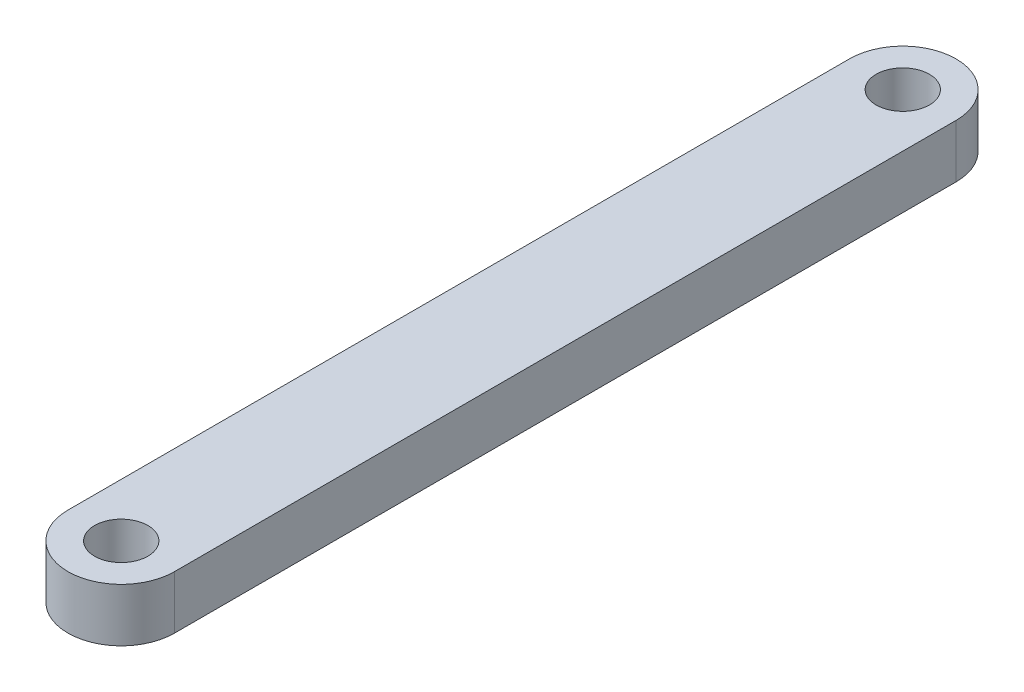
ISO-10303-21;
HEADER;
FILE_DESCRIPTION(('STEP AP214'),'2;1');
FILE_NAME('part.step','',(''),(''),'','','');
FILE_SCHEMA(('AUTOMOTIVE_DESIGN { 1 0 10303 214 1 1 1 1 }'));
ENDSEC;
DATA;
#1=APPLICATION_CONTEXT('core data for automotive mechanical design processes');
#2=APPLICATION_PROTOCOL_DEFINITION('international standard','automotive_design',2000,#1);
#3=PRODUCT_CONTEXT('',#1,'mechanical');
#4=PRODUCT('Part','Part','',(#3));
#5=PRODUCT_RELATED_PRODUCT_CATEGORY('part','',(#4));
#6=PRODUCT_DEFINITION_FORMATION('','',#4);
#7=PRODUCT_DEFINITION_CONTEXT('part definition',#1,'design');
#8=PRODUCT_DEFINITION('design','',#6,#7);
#9=PRODUCT_DEFINITION_SHAPE('','',#8);
#10=(LENGTH_UNIT() NAMED_UNIT(*) SI_UNIT(.MILLI.,.METRE.));
#11=(NAMED_UNIT(*) PLANE_ANGLE_UNIT() SI_UNIT($,.RADIAN.));
#12=(NAMED_UNIT(*) SI_UNIT($,.STERADIAN.) SOLID_ANGLE_UNIT());
#13=UNCERTAINTY_MEASURE_WITH_UNIT(LENGTH_MEASURE(1.E-05),#10,'distance_accuracy_value','');
#14=(GEOMETRIC_REPRESENTATION_CONTEXT(3) GLOBAL_UNCERTAINTY_ASSIGNED_CONTEXT((#13)) GLOBAL_UNIT_ASSIGNED_CONTEXT((#10,
#11,#12)) REPRESENTATION_CONTEXT('',''));
#15=CARTESIAN_POINT('',(0.,0.,0.));
#16=DIRECTION('',(0.,0.,1.));
#17=DIRECTION('',(1.,0.,0.));
#18=AXIS2_PLACEMENT_3D('',#15,#16,#17);
#19=CARTESIAN_POINT('',(0.,3.,44.));
#20=DIRECTION('',(0.,-1.,0.));
#21=DIRECTION('',(0.,0.,-1.));
#22=AXIS2_PLACEMENT_3D('',#19,#20,#21);
#23=PLANE('',#22);
#24=CARTESIAN_POINT('',(0.,3.,44.));
#25=DIRECTION('',(0.,1.,0.));
#26=DIRECTION('',(0.,0.,-1.));
#27=AXIS2_PLACEMENT_3D('',#24,#25,#26);
#28=CIRCLE('',#27,3.00000000000001);
#29=CARTESIAN_POINT('',(-3.00000000000001,3.,44.));
#30=VERTEX_POINT('',#29);
#31=CARTESIAN_POINT('',(3.00000000000001,3.,44.));
#32=VERTEX_POINT('',#31);
#33=EDGE_CURVE('E85',#30,#32,#28,.T.);
#34=ORIENTED_EDGE('',*,*,#33,.T.);
#35=DIRECTION('',(0.,0.,-1.));
#36=VECTOR('',#35,1.);
#37=CARTESIAN_POINT('',(3.,3.,0.));
#38=LINE('',#37,#36);
#39=CARTESIAN_POINT('',(3.,3.,0.));
#40=VERTEX_POINT('',#39);
#41=EDGE_CURVE('E80',#32,#40,#38,.T.);
#42=ORIENTED_EDGE('',*,*,#41,.T.);
#43=CARTESIAN_POINT('',(0.,3.,0.));
#44=DIRECTION('',(0.,1.,0.));
#45=DIRECTION('',(0.,0.,1.));
#46=AXIS2_PLACEMENT_3D('',#43,#44,#45);
#47=CIRCLE('',#46,3.);
#48=CARTESIAN_POINT('',(-3.,3.,0.));
#49=VERTEX_POINT('',#48);
#50=EDGE_CURVE('E83',#40,#49,#47,.T.);
#51=ORIENTED_EDGE('',*,*,#50,.T.);
#52=DIRECTION('',(0.,0.,1.));
#53=VECTOR('',#52,1.);
#54=CARTESIAN_POINT('',(-3.,3.,0.));
#55=LINE('',#54,#53);
#56=EDGE_CURVE('E50',#49,#30,#55,.T.);
#57=ORIENTED_EDGE('',*,*,#56,.T.);
#58=EDGE_LOOP('',(#34,#42,#51,#57));
#59=FACE_BOUND('',#58,.T.);
#60=CARTESIAN_POINT('',(0.,3.,0.));
#61=DIRECTION('',(0.,1.,0.));
#62=DIRECTION('',(0.,0.,1.));
#63=AXIS2_PLACEMENT_3D('',#60,#61,#62);
#64=CIRCLE('',#63,1.5);
#65=CARTESIAN_POINT('',(0.,3.,1.5));
#66=VERTEX_POINT('',#65);
#67=EDGE_CURVE('E100',#66,#66,#64,.T.);
#68=ORIENTED_EDGE('',*,*,#67,.F.);
#69=EDGE_LOOP('',(#68));
#70=FACE_BOUND('',#69,.T.);
#71=CARTESIAN_POINT('',(0.,3.,44.));
#72=DIRECTION('',(0.,1.,0.));
#73=DIRECTION('',(0.,0.,-1.));
#74=AXIS2_PLACEMENT_3D('',#71,#72,#73);
#75=CIRCLE('',#74,1.5);
#76=CARTESIAN_POINT('',(0.,3.,42.5));
#77=VERTEX_POINT('',#76);
#78=EDGE_CURVE('E115',#77,#77,#75,.T.);
#79=ORIENTED_EDGE('',*,*,#78,.F.);
#80=EDGE_LOOP('',(#79));
#81=FACE_BOUND('',#80,.T.);
#82=ADVANCED_FACE('F33',(#59,#70,#81),#23,.F.);
#83=CARTESIAN_POINT('',(0.,0.,44.));
#84=DIRECTION('',(0.,-1.,0.));
#85=DIRECTION('',(0.,0.,-1.));
#86=AXIS2_PLACEMENT_3D('',#83,#84,#85);
#87=PLANE('',#86);
#88=CARTESIAN_POINT('',(0.,0.,0.));
#89=DIRECTION('',(0.,1.,0.));
#90=DIRECTION('',(0.,0.,1.));
#91=AXIS2_PLACEMENT_3D('',#88,#89,#90);
#92=CIRCLE('',#91,1.5);
#93=CARTESIAN_POINT('',(0.,0.,1.5));
#94=VERTEX_POINT('',#93);
#95=EDGE_CURVE('E112',#94,#94,#92,.T.);
#96=ORIENTED_EDGE('',*,*,#95,.T.);
#97=EDGE_LOOP('',(#96));
#98=FACE_BOUND('',#97,.T.);
#99=CARTESIAN_POINT('',(0.,0.,44.));
#100=DIRECTION('',(0.,1.,0.));
#101=DIRECTION('',(0.,0.,-1.));
#102=AXIS2_PLACEMENT_3D('',#99,#100,#101);
#103=CIRCLE('',#102,3.00000000000001);
#104=CARTESIAN_POINT('',(-3.00000000000001,0.,44.));
#105=VERTEX_POINT('',#104);
#106=CARTESIAN_POINT('',(3.00000000000001,0.,44.));
#107=VERTEX_POINT('',#106);
#108=EDGE_CURVE('E97',#105,#107,#103,.T.);
#109=ORIENTED_EDGE('',*,*,#108,.F.);
#110=DIRECTION('',(0.,0.,1.));
#111=VECTOR('',#110,1.);
#112=CARTESIAN_POINT('',(-3.,0.,0.));
#113=LINE('',#112,#111);
#114=CARTESIAN_POINT('',(-3.,0.,0.));
#115=VERTEX_POINT('',#114);
#116=EDGE_CURVE('E73',#115,#105,#113,.T.);
#117=ORIENTED_EDGE('',*,*,#116,.F.);
#118=CARTESIAN_POINT('',(0.,0.,0.));
#119=DIRECTION('',(0.,1.,0.));
#120=DIRECTION('',(0.,0.,1.));
#121=AXIS2_PLACEMENT_3D('',#118,#119,#120);
#122=CIRCLE('',#121,3.);
#123=CARTESIAN_POINT('',(3.,0.,0.));
#124=VERTEX_POINT('',#123);
#125=EDGE_CURVE('E67',#124,#115,#122,.T.);
#126=ORIENTED_EDGE('',*,*,#125,.F.);
#127=DIRECTION('',(0.,0.,-1.));
#128=VECTOR('',#127,1.);
#129=CARTESIAN_POINT('',(3.,0.,0.));
#130=LINE('',#129,#128);
#131=EDGE_CURVE('E89',#107,#124,#130,.T.);
#132=ORIENTED_EDGE('',*,*,#131,.F.);
#133=EDGE_LOOP('',(#109,#117,#126,#132));
#134=FACE_BOUND('',#133,.T.);
#135=CARTESIAN_POINT('',(0.,0.,44.));
#136=DIRECTION('',(0.,1.,0.));
#137=DIRECTION('',(0.,0.,-1.));
#138=AXIS2_PLACEMENT_3D('',#135,#136,#137);
#139=CIRCLE('',#138,1.5);
#140=CARTESIAN_POINT('',(0.,0.,42.5));
#141=VERTEX_POINT('',#140);
#142=EDGE_CURVE('E118',#141,#141,#139,.T.);
#143=ORIENTED_EDGE('',*,*,#142,.T.);
#144=EDGE_LOOP('',(#143));
#145=FACE_BOUND('',#144,.T.);
#146=ADVANCED_FACE('F108',(#98,#134,#145),#87,.T.);
#147=CARTESIAN_POINT('',(0.,3.,44.));
#148=DIRECTION('',(0.,-1.,0.));
#149=DIRECTION('',(0.,0.,-1.));
#150=AXIS2_PLACEMENT_3D('',#147,#148,#149);
#151=CYLINDRICAL_SURFACE('',#150,3.00000000000001);
#152=ORIENTED_EDGE('',*,*,#108,.T.);
#153=DIRECTION('',(0.,-1.,0.));
#154=VECTOR('',#153,1.);
#155=CARTESIAN_POINT('',(3.00000000000001,3.,44.));
#156=LINE('',#155,#154);
#157=EDGE_CURVE('E11',#32,#107,#156,.T.);
#158=ORIENTED_EDGE('',*,*,#157,.F.);
#159=ORIENTED_EDGE('',*,*,#33,.F.);
#160=DIRECTION('',(0.,-1.,0.));
#161=VECTOR('',#160,1.);
#162=CARTESIAN_POINT('',(-3.00000000000001,3.,44.));
#163=LINE('',#162,#161);
#164=EDGE_CURVE('E93',#30,#105,#163,.T.);
#165=ORIENTED_EDGE('',*,*,#164,.T.);
#166=EDGE_LOOP('',(#152,#158,#159,#165));
#167=FACE_BOUND('',#166,.T.);
#168=ADVANCED_FACE('F35',(#167),#151,.T.);
#169=CARTESIAN_POINT('',(3.,3.,0.));
#170=DIRECTION('',(-1.,0.,0.));
#171=DIRECTION('',(0.,0.,1.));
#172=AXIS2_PLACEMENT_3D('',#169,#170,#171);
#173=PLANE('',#172);
#174=ORIENTED_EDGE('',*,*,#131,.T.);
#175=DIRECTION('',(0.,-1.,0.));
#176=VECTOR('',#175,1.);
#177=CARTESIAN_POINT('',(3.,3.,0.));
#178=LINE('',#177,#176);
#179=EDGE_CURVE('E42',#40,#124,#178,.T.);
#180=ORIENTED_EDGE('',*,*,#179,.F.);
#181=ORIENTED_EDGE('',*,*,#41,.F.);
#182=ORIENTED_EDGE('',*,*,#157,.T.);
#183=EDGE_LOOP('',(#174,#180,#181,#182));
#184=FACE_BOUND('',#183,.T.);
#185=ADVANCED_FACE('F88',(#184),#173,.F.);
#186=CARTESIAN_POINT('',(0.,3.,0.));
#187=DIRECTION('',(0.,-1.,0.));
#188=DIRECTION('',(0.,0.,-1.));
#189=AXIS2_PLACEMENT_3D('',#186,#187,#188);
#190=CYLINDRICAL_SURFACE('',#189,3.);
#191=ORIENTED_EDGE('',*,*,#125,.T.);
#192=DIRECTION('',(0.,-1.,0.));
#193=VECTOR('',#192,1.);
#194=CARTESIAN_POINT('',(-3.,3.,0.));
#195=LINE('',#194,#193);
#196=EDGE_CURVE('E90',#49,#115,#195,.T.);
#197=ORIENTED_EDGE('',*,*,#196,.F.);
#198=ORIENTED_EDGE('',*,*,#50,.F.);
#199=ORIENTED_EDGE('',*,*,#179,.T.);
#200=EDGE_LOOP('',(#191,#197,#198,#199));
#201=FACE_BOUND('',#200,.T.);
#202=ADVANCED_FACE('F91',(#201),#190,.T.);
#203=CARTESIAN_POINT('',(-3.,3.,0.));
#204=DIRECTION('',(1.,0.,0.));
#205=DIRECTION('',(0.,0.,-1.));
#206=AXIS2_PLACEMENT_3D('',#203,#204,#205);
#207=PLANE('',#206);
#208=ORIENTED_EDGE('',*,*,#116,.T.);
#209=ORIENTED_EDGE('',*,*,#164,.F.);
#210=ORIENTED_EDGE('',*,*,#56,.F.);
#211=ORIENTED_EDGE('',*,*,#196,.T.);
#212=EDGE_LOOP('',(#208,#209,#210,#211));
#213=FACE_BOUND('',#212,.T.);
#214=ADVANCED_FACE('F105',(#213),#207,.F.);
#215=CARTESIAN_POINT('',(0.,3.,0.));
#216=DIRECTION('',(0.,-1.,0.));
#217=DIRECTION('',(0.,0.,-1.));
#218=AXIS2_PLACEMENT_3D('',#215,#216,#217);
#219=CYLINDRICAL_SURFACE('',#218,1.5);
#220=ORIENTED_EDGE('',*,*,#67,.T.);
#221=EDGE_LOOP('',(#220));
#222=FACE_BOUND('',#221,.T.);
#223=ORIENTED_EDGE('',*,*,#95,.F.);
#224=EDGE_LOOP('',(#223));
#225=FACE_BOUND('',#224,.T.);
#226=ADVANCED_FACE('F135',(#222,#225),#219,.F.);
#227=CARTESIAN_POINT('',(0.,3.,44.));
#228=DIRECTION('',(0.,-1.,0.));
#229=DIRECTION('',(0.,0.,-1.));
#230=AXIS2_PLACEMENT_3D('',#227,#228,#229);
#231=CYLINDRICAL_SURFACE('',#230,1.5);
#232=ORIENTED_EDGE('',*,*,#78,.T.);
#233=EDGE_LOOP('',(#232));
#234=FACE_BOUND('',#233,.T.);
#235=ORIENTED_EDGE('',*,*,#142,.F.);
#236=EDGE_LOOP('',(#235));
#237=FACE_BOUND('',#236,.T.);
#238=ADVANCED_FACE('F124',(#234,#237),#231,.F.);
#239=CLOSED_SHELL('',(#82,#146,#168,#185,#202,#214,#226,#238));
#240=MANIFOLD_SOLID_BREP('B2',#239);
#241=ADVANCED_BREP_SHAPE_REPRESENTATION('',(#18,#240),#14);
#242=SHAPE_DEFINITION_REPRESENTATION(#9,#241);
ENDSEC;
END-ISO-10303-21;
